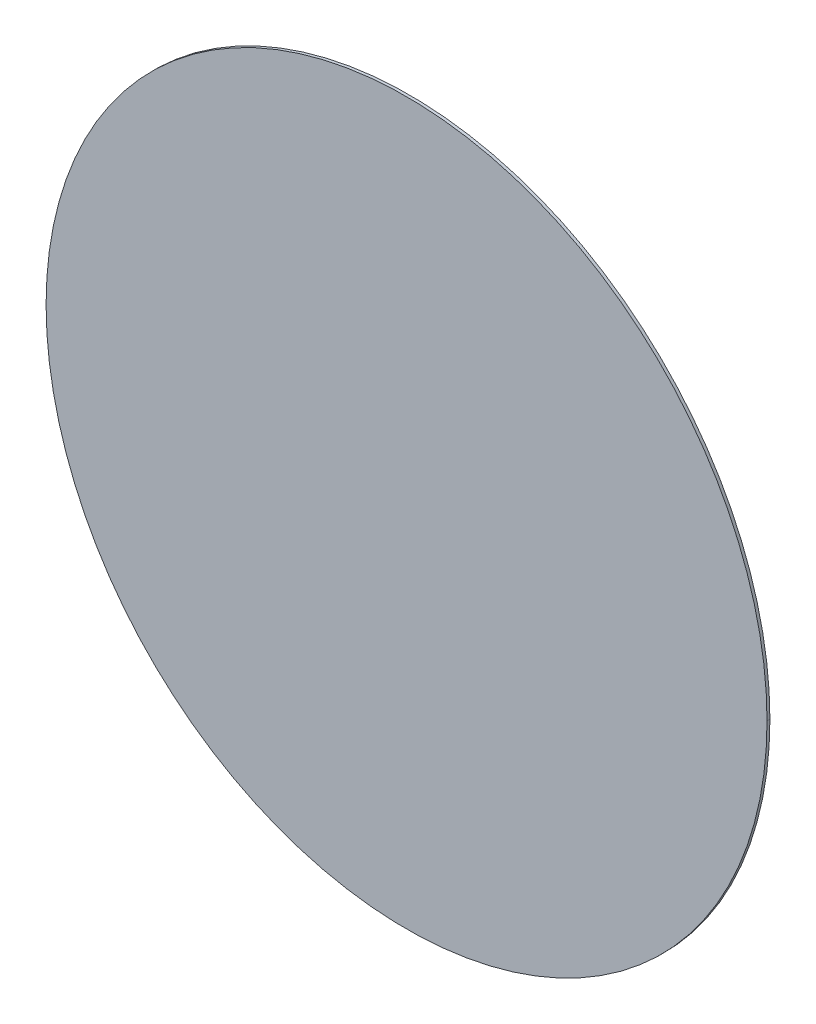
ISO-10303-21;
HEADER;
FILE_DESCRIPTION(('STEP AP214'),'2;1');
FILE_NAME('part.step','',(''),(''),'','','');
FILE_SCHEMA(('AUTOMOTIVE_DESIGN { 1 0 10303 214 1 1 1 1 }'));
ENDSEC;
DATA;
#1=APPLICATION_CONTEXT('core data for automotive mechanical design processes');
#2=APPLICATION_PROTOCOL_DEFINITION('international standard','automotive_design',2000,#1);
#3=PRODUCT_CONTEXT('',#1,'mechanical');
#4=PRODUCT('Part','Part','',(#3));
#5=PRODUCT_RELATED_PRODUCT_CATEGORY('part','',(#4));
#6=PRODUCT_DEFINITION_FORMATION('','',#4);
#7=PRODUCT_DEFINITION_CONTEXT('part definition',#1,'design');
#8=PRODUCT_DEFINITION('design','',#6,#7);
#9=PRODUCT_DEFINITION_SHAPE('','',#8);
#10=(LENGTH_UNIT() NAMED_UNIT(*) SI_UNIT(.MILLI.,.METRE.));
#11=(NAMED_UNIT(*) PLANE_ANGLE_UNIT() SI_UNIT($,.RADIAN.));
#12=(NAMED_UNIT(*) SI_UNIT($,.STERADIAN.) SOLID_ANGLE_UNIT());
#13=UNCERTAINTY_MEASURE_WITH_UNIT(LENGTH_MEASURE(1.E-05),#10,'distance_accuracy_value','');
#14=(GEOMETRIC_REPRESENTATION_CONTEXT(3) GLOBAL_UNCERTAINTY_ASSIGNED_CONTEXT((#13)) GLOBAL_UNIT_ASSIGNED_CONTEXT((#10,
#11,#12)) REPRESENTATION_CONTEXT('',''));
#15=CARTESIAN_POINT('',(0.,0.,0.));
#16=DIRECTION('',(0.,0.,1.));
#17=DIRECTION('',(1.,0.,0.));
#18=AXIS2_PLACEMENT_3D('',#15,#16,#17);
#19=CARTESIAN_POINT('',(0.,0.,0.));
#20=DIRECTION('',(0.,0.,1.));
#21=DIRECTION('',(1.,0.,0.));
#22=AXIS2_PLACEMENT_3D('',#19,#20,#21);
#23=PLANE('',#22);
#24=CARTESIAN_POINT('',(0.,0.,0.));
#25=DIRECTION('',(0.,0.,1.));
#26=DIRECTION('',(1.,0.,0.));
#27=AXIS2_PLACEMENT_3D('',#24,#25,#26);
#28=CIRCLE('',#27,25.);
#29=CARTESIAN_POINT('',(-25.,0.,0.));
#30=VERTEX_POINT('',#29);
#31=CARTESIAN_POINT('',(25.,0.,0.));
#32=VERTEX_POINT('',#31);
#33=EDGE_CURVE('E10',#30,#32,#28,.T.);
#34=ORIENTED_EDGE('',*,*,#33,.F.);
#35=CARTESIAN_POINT('',(0.,0.,0.));
#36=DIRECTION('',(0.,0.,1.));
#37=DIRECTION('',(1.,0.,0.));
#38=AXIS2_PLACEMENT_3D('',#35,#36,#37);
#39=CIRCLE('',#38,25.);
#40=EDGE_CURVE('E20',#32,#30,#39,.T.);
#41=ORIENTED_EDGE('',*,*,#40,.F.);
#42=EDGE_LOOP('',(#34,#41));
#43=FACE_BOUND('',#42,.T.);
#44=ADVANCED_FACE('F16',(#43),#23,.F.);
#45=CARTESIAN_POINT('',(0.,0.,0.2));
#46=DIRECTION('',(0.,0.,1.));
#47=DIRECTION('',(1.,0.,0.));
#48=AXIS2_PLACEMENT_3D('',#45,#46,#47);
#49=PLANE('',#48);
#50=CARTESIAN_POINT('',(0.,0.,0.2));
#51=DIRECTION('',(0.,0.,1.));
#52=DIRECTION('',(1.,0.,0.));
#53=AXIS2_PLACEMENT_3D('',#50,#51,#52);
#54=CIRCLE('',#53,25.);
#55=CARTESIAN_POINT('',(-25.,0.,0.2));
#56=VERTEX_POINT('',#55);
#57=CARTESIAN_POINT('',(25.,0.,0.2));
#58=VERTEX_POINT('',#57);
#59=EDGE_CURVE('E27',#56,#58,#54,.T.);
#60=ORIENTED_EDGE('',*,*,#59,.T.);
#61=CARTESIAN_POINT('',(0.,0.,0.2));
#62=DIRECTION('',(0.,0.,1.));
#63=DIRECTION('',(1.,0.,0.));
#64=AXIS2_PLACEMENT_3D('',#61,#62,#63);
#65=CIRCLE('',#64,25.);
#66=EDGE_CURVE('E58',#58,#56,#65,.T.);
#67=ORIENTED_EDGE('',*,*,#66,.T.);
#68=EDGE_LOOP('',(#60,#67));
#69=FACE_BOUND('',#68,.T.);
#70=ADVANCED_FACE('F18',(#69),#49,.T.);
#71=CARTESIAN_POINT('',(0.,0.,0.2));
#72=DIRECTION('',(0.,0.,-1.));
#73=DIRECTION('',(-1.,0.,0.));
#74=AXIS2_PLACEMENT_3D('',#71,#72,#73);
#75=CYLINDRICAL_SURFACE('',#74,25.);
#76=DIRECTION('',(0.,0.,-1.));
#77=VECTOR('',#76,1.);
#78=CARTESIAN_POINT('',(25.,0.,0.2));
#79=LINE('',#78,#77);
#80=EDGE_CURVE('E63',#58,#32,#79,.T.);
#81=ORIENTED_EDGE('',*,*,#80,.F.);
#82=ORIENTED_EDGE('',*,*,#59,.F.);
#83=DIRECTION('',(0.,0.,-1.));
#84=VECTOR('',#83,1.);
#85=CARTESIAN_POINT('',(-25.,0.,0.2));
#86=LINE('',#85,#84);
#87=EDGE_CURVE('E60',#56,#30,#86,.T.);
#88=ORIENTED_EDGE('',*,*,#87,.T.);
#89=ORIENTED_EDGE('',*,*,#33,.T.);
#90=EDGE_LOOP('',(#81,#82,#88,#89));
#91=FACE_BOUND('',#90,.T.);
#92=ADVANCED_FACE('F64',(#91),#75,.T.);
#93=CARTESIAN_POINT('',(0.,0.,0.2));
#94=DIRECTION('',(0.,0.,-1.));
#95=DIRECTION('',(-1.,0.,0.));
#96=AXIS2_PLACEMENT_3D('',#93,#94,#95);
#97=CYLINDRICAL_SURFACE('',#96,25.);
#98=ORIENTED_EDGE('',*,*,#66,.F.);
#99=ORIENTED_EDGE('',*,*,#80,.T.);
#100=ORIENTED_EDGE('',*,*,#40,.T.);
#101=ORIENTED_EDGE('',*,*,#87,.F.);
#102=EDGE_LOOP('',(#98,#99,#100,#101));
#103=FACE_BOUND('',#102,.T.);
#104=ADVANCED_FACE('F68',(#103),#97,.T.);
#105=CLOSED_SHELL('',(#44,#70,#92,#104));
#106=MANIFOLD_SOLID_BREP('B1',#105);
#107=ADVANCED_BREP_SHAPE_REPRESENTATION('',(#18,#106),#14);
#108=SHAPE_DEFINITION_REPRESENTATION(#9,#107);
ENDSEC;
END-ISO-10303-21;
